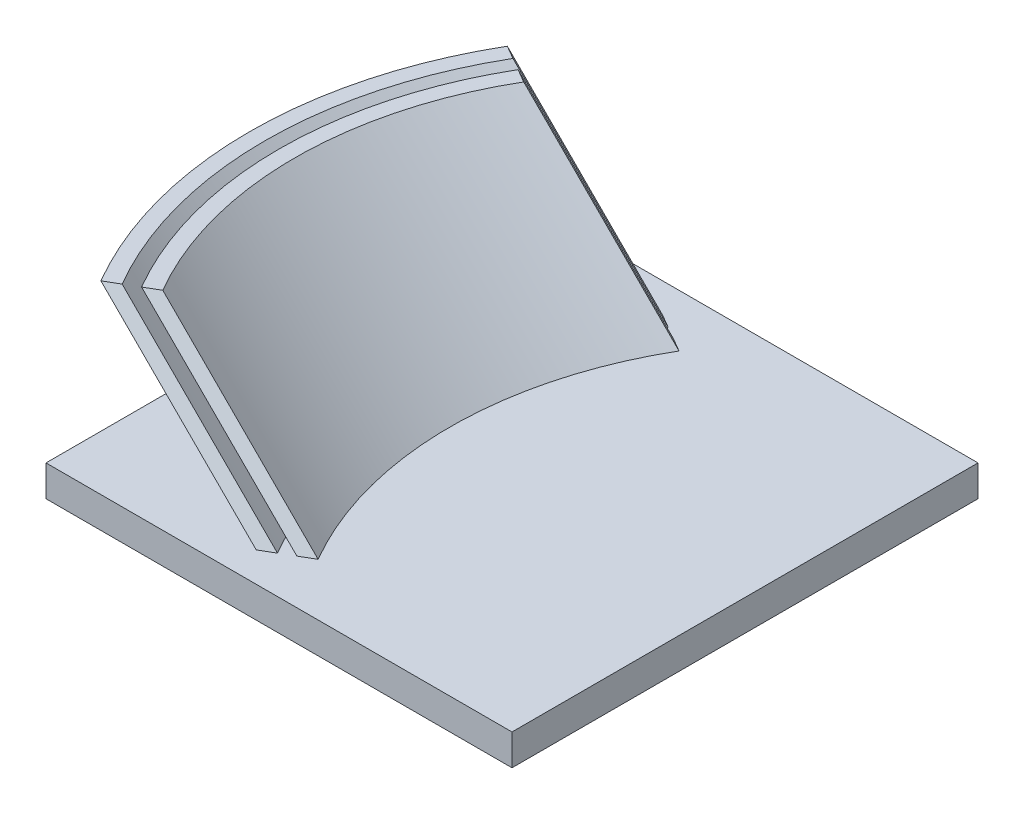
ISO-10303-21;
HEADER;
FILE_DESCRIPTION(('STEP AP214'),'2;1');
FILE_NAME('part.step','',(''),(''),'','','');
FILE_SCHEMA(('AUTOMOTIVE_DESIGN { 1 0 10303 214 1 1 1 1 }'));
ENDSEC;
DATA;
#1=APPLICATION_CONTEXT('core data for automotive mechanical design processes');
#2=APPLICATION_PROTOCOL_DEFINITION('international standard','automotive_design',2000,#1);
#3=PRODUCT_CONTEXT('',#1,'mechanical');
#4=PRODUCT('Part','Part','',(#3));
#5=PRODUCT_RELATED_PRODUCT_CATEGORY('part','',(#4));
#6=PRODUCT_DEFINITION_FORMATION('','',#4);
#7=PRODUCT_DEFINITION_CONTEXT('part definition',#1,'design');
#8=PRODUCT_DEFINITION('design','',#6,#7);
#9=PRODUCT_DEFINITION_SHAPE('','',#8);
#10=(LENGTH_UNIT() NAMED_UNIT(*) SI_UNIT(.MILLI.,.METRE.));
#11=(NAMED_UNIT(*) PLANE_ANGLE_UNIT() SI_UNIT($,.RADIAN.));
#12=(NAMED_UNIT(*) SI_UNIT($,.STERADIAN.) SOLID_ANGLE_UNIT());
#13=UNCERTAINTY_MEASURE_WITH_UNIT(LENGTH_MEASURE(1.E-05),#10,'distance_accuracy_value','');
#14=(GEOMETRIC_REPRESENTATION_CONTEXT(3) GLOBAL_UNCERTAINTY_ASSIGNED_CONTEXT((#13)) GLOBAL_UNIT_ASSIGNED_CONTEXT((#10,
#11,#12)) REPRESENTATION_CONTEXT('',''));
#15=CARTESIAN_POINT('',(0.,0.,0.));
#16=DIRECTION('',(0.,0.,1.));
#17=DIRECTION('',(1.,0.,0.));
#18=AXIS2_PLACEMENT_3D('',#15,#16,#17);
#19=CARTESIAN_POINT('',(-15.,2.,-15.));
#20=DIRECTION('',(1.,0.,0.));
#21=DIRECTION('',(0.,0.,-1.));
#22=AXIS2_PLACEMENT_3D('',#19,#20,#21);
#23=PLANE('',#22);
#24=DIRECTION('',(0.,0.,1.));
#25=VECTOR('',#24,1.);
#26=CARTESIAN_POINT('',(-15.,0.,-15.));
#27=LINE('',#26,#25);
#28=CARTESIAN_POINT('',(-15.,0.,-15.));
#29=VERTEX_POINT('',#28);
#30=CARTESIAN_POINT('',(-15.,0.,15.));
#31=VERTEX_POINT('',#30);
#32=EDGE_CURVE('E187',#29,#31,#27,.T.);
#33=ORIENTED_EDGE('',*,*,#32,.T.);
#34=DIRECTION('',(0.,-1.,0.));
#35=VECTOR('',#34,1.);
#36=CARTESIAN_POINT('',(-15.,2.,15.));
#37=LINE('',#36,#35);
#38=CARTESIAN_POINT('',(-15.,2.,15.));
#39=VERTEX_POINT('',#38);
#40=EDGE_CURVE('E11',#39,#31,#37,.T.);
#41=ORIENTED_EDGE('',*,*,#40,.F.);
#42=DIRECTION('',(0.,0.,1.));
#43=VECTOR('',#42,1.);
#44=CARTESIAN_POINT('',(-15.,2.,-15.));
#45=LINE('',#44,#43);
#46=CARTESIAN_POINT('',(-15.,2.,-15.));
#47=VERTEX_POINT('',#46);
#48=EDGE_CURVE('E188',#47,#39,#45,.T.);
#49=ORIENTED_EDGE('',*,*,#48,.F.);
#50=DIRECTION('',(0.,-1.,0.));
#51=VECTOR('',#50,1.);
#52=CARTESIAN_POINT('',(-15.,2.,-15.));
#53=LINE('',#52,#51);
#54=EDGE_CURVE('E200',#47,#29,#53,.T.);
#55=ORIENTED_EDGE('',*,*,#54,.T.);
#56=EDGE_LOOP('',(#33,#41,#49,#55));
#57=FACE_BOUND('',#56,.T.);
#58=ADVANCED_FACE('F33',(#57),#23,.F.);
#59=CARTESIAN_POINT('',(-15.,2.,15.));
#60=DIRECTION('',(0.,0.,-1.));
#61=DIRECTION('',(-1.,0.,0.));
#62=AXIS2_PLACEMENT_3D('',#59,#60,#61);
#63=PLANE('',#62);
#64=DIRECTION('',(1.,0.,0.));
#65=VECTOR('',#64,1.);
#66=CARTESIAN_POINT('',(-15.,0.,15.));
#67=LINE('',#66,#65);
#68=CARTESIAN_POINT('',(15.,0.,15.));
#69=VERTEX_POINT('',#68);
#70=EDGE_CURVE('E203',#31,#69,#67,.T.);
#71=ORIENTED_EDGE('',*,*,#70,.T.);
#72=DIRECTION('',(0.,-1.,0.));
#73=VECTOR('',#72,1.);
#74=CARTESIAN_POINT('',(15.,2.,15.));
#75=LINE('',#74,#73);
#76=CARTESIAN_POINT('',(15.,2.,15.));
#77=VERTEX_POINT('',#76);
#78=EDGE_CURVE('E40',#77,#69,#75,.T.);
#79=ORIENTED_EDGE('',*,*,#78,.F.);
#80=DIRECTION('',(1.,0.,0.));
#81=VECTOR('',#80,1.);
#82=CARTESIAN_POINT('',(-15.,2.,15.));
#83=LINE('',#82,#81);
#84=EDGE_CURVE('E191',#39,#77,#83,.T.);
#85=ORIENTED_EDGE('',*,*,#84,.F.);
#86=ORIENTED_EDGE('',*,*,#40,.T.);
#87=EDGE_LOOP('',(#71,#79,#85,#86));
#88=FACE_BOUND('',#87,.T.);
#89=ADVANCED_FACE('F219',(#88),#63,.F.);
#90=CARTESIAN_POINT('',(15.,2.,-15.));
#91=DIRECTION('',(1.,0.,0.));
#92=DIRECTION('',(0.,0.,-1.));
#93=AXIS2_PLACEMENT_3D('',#90,#91,#92);
#94=PLANE('',#93);
#95=DIRECTION('',(0.,0.,1.));
#96=VECTOR('',#95,1.);
#97=CARTESIAN_POINT('',(15.,0.,-15.));
#98=LINE('',#97,#96);
#99=CARTESIAN_POINT('',(15.,0.,-15.));
#100=VERTEX_POINT('',#99);
#101=EDGE_CURVE('E206',#100,#69,#98,.T.);
#102=ORIENTED_EDGE('',*,*,#101,.F.);
#103=DIRECTION('',(0.,-1.,0.));
#104=VECTOR('',#103,1.);
#105=CARTESIAN_POINT('',(15.,2.,-15.));
#106=LINE('',#105,#104);
#107=CARTESIAN_POINT('',(15.,2.,-15.));
#108=VERTEX_POINT('',#107);
#109=EDGE_CURVE('E212',#108,#100,#106,.T.);
#110=ORIENTED_EDGE('',*,*,#109,.F.);
#111=DIRECTION('',(0.,0.,1.));
#112=VECTOR('',#111,1.);
#113=CARTESIAN_POINT('',(15.,2.,-15.));
#114=LINE('',#113,#112);
#115=EDGE_CURVE('E194',#108,#77,#114,.T.);
#116=ORIENTED_EDGE('',*,*,#115,.T.);
#117=ORIENTED_EDGE('',*,*,#78,.T.);
#118=EDGE_LOOP('',(#102,#110,#116,#117));
#119=FACE_BOUND('',#118,.T.);
#120=ADVANCED_FACE('F216',(#119),#94,.T.);
#121=CARTESIAN_POINT('',(-15.,2.,-15.));
#122=DIRECTION('',(0.,0.,-1.));
#123=DIRECTION('',(-1.,0.,0.));
#124=AXIS2_PLACEMENT_3D('',#121,#122,#123);
#125=PLANE('',#124);
#126=DIRECTION('',(1.,0.,0.));
#127=VECTOR('',#126,1.);
#128=CARTESIAN_POINT('',(-15.,0.,-15.));
#129=LINE('',#128,#127);
#130=EDGE_CURVE('E192',#29,#100,#129,.T.);
#131=ORIENTED_EDGE('',*,*,#130,.F.);
#132=ORIENTED_EDGE('',*,*,#54,.F.);
#133=DIRECTION('',(1.,0.,0.));
#134=VECTOR('',#133,1.);
#135=CARTESIAN_POINT('',(-15.,2.,-15.));
#136=LINE('',#135,#134);
#137=EDGE_CURVE('E197',#47,#108,#136,.T.);
#138=ORIENTED_EDGE('',*,*,#137,.T.);
#139=ORIENTED_EDGE('',*,*,#109,.T.);
#140=EDGE_LOOP('',(#131,#132,#138,#139));
#141=FACE_BOUND('',#140,.T.);
#142=ADVANCED_FACE('F226',(#141),#125,.T.);
#143=CARTESIAN_POINT('',(0.,2.,0.));
#144=DIRECTION('',(0.,1.,0.));
#145=DIRECTION('',(0.,0.,1.));
#146=AXIS2_PLACEMENT_3D('',#143,#144,#145);
#147=PLANE('',#146);
#148=CARTESIAN_POINT('',(19.0856,2.,0.));
#149=DIRECTION('',(0.,1.,0.));
#150=DIRECTION('',(0.,0.,1.));
#151=AXIS2_PLACEMENT_3D('',#148,#149,#150);
#152=CIRCLE('',#151,26.);
#153=CARTESIAN_POINT('',(-3.38297345298926,2.,-13.0829357174767));
#154=VERTEX_POINT('',#153);
#155=CARTESIAN_POINT('',(-3.38297345298923,2.,13.0829357174767));
#156=VERTEX_POINT('',#155);
#157=EDGE_CURVE('E116',#154,#156,#152,.T.);
#158=ORIENTED_EDGE('',*,*,#157,.F.);
#159=DIRECTION('',(-0.864175902038048,0.,-0.503189835287564));
#160=VECTOR('',#159,1.);
#161=CARTESIAN_POINT('',(-2.51879755095121,2.,-12.5797458821891));
#162=LINE('',#161,#160);
#163=CARTESIAN_POINT('',(-2.51879755095121,2.,-12.5797458821891));
#164=VERTEX_POINT('',#163);
#165=EDGE_CURVE('E120',#164,#154,#162,.T.);
#166=ORIENTED_EDGE('',*,*,#165,.F.);
#167=CARTESIAN_POINT('',(19.0856,2.,0.));
#168=DIRECTION('',(0.,-1.,0.));
#169=DIRECTION('',(0.,0.,-1.));
#170=AXIS2_PLACEMENT_3D('',#167,#168,#169);
#171=CIRCLE('',#170,25.);
#172=CARTESIAN_POINT('',(-2.51879755095118,2.,12.5797458821891));
#173=VERTEX_POINT('',#172);
#174=EDGE_CURVE('E52',#173,#164,#171,.T.);
#175=ORIENTED_EDGE('',*,*,#174,.F.);
#176=DIRECTION('',(0.864175902038047,0.,-0.503189835287566));
#177=VECTOR('',#176,1.);
#178=CARTESIAN_POINT('',(-2.51879755095119,2.,12.5797458821891));
#179=LINE('',#178,#177);
#180=EDGE_CURVE('E47',#156,#173,#179,.T.);
#181=ORIENTED_EDGE('',*,*,#180,.F.);
#182=EDGE_LOOP('',(#158,#166,#175,#181));
#183=FACE_BOUND('',#182,.T.);
#184=CARTESIAN_POINT('',(19.0856,2.,0.));
#185=DIRECTION('',(0.,1.,0.));
#186=DIRECTION('',(0.,0.,-1.));
#187=AXIS2_PLACEMENT_3D('',#184,#185,#186);
#188=CIRCLE('',#187,24.0856);
#189=CARTESIAN_POINT('',(-1.72859510612762,2.,-12.1196290968022));
#190=VERTEX_POINT('',#189);
#191=CARTESIAN_POINT('',(-1.72859510612761,2.,12.1196290968022));
#192=VERTEX_POINT('',#191);
#193=EDGE_CURVE('E155',#190,#192,#188,.T.);
#194=ORIENTED_EDGE('',*,*,#193,.F.);
#195=DIRECTION('',(-0.864175902038049,0.,-0.503189835287562));
#196=VECTOR('',#195,1.);
#197=CARTESIAN_POINT('',(-0.864419204089574,2.,-11.6164392615146));
#198=LINE('',#197,#196);
#199=CARTESIAN_POINT('',(-0.864419204089573,2.,-11.6164392615146));
#200=VERTEX_POINT('',#199);
#201=EDGE_CURVE('E168',#200,#190,#198,.T.);
#202=ORIENTED_EDGE('',*,*,#201,.F.);
#203=CARTESIAN_POINT('',(19.0856,2.,0.));
#204=DIRECTION('',(0.,-1.,0.));
#205=DIRECTION('',(0.,0.,1.));
#206=AXIS2_PLACEMENT_3D('',#203,#204,#205);
#207=CIRCLE('',#206,23.0856);
#208=CARTESIAN_POINT('',(-0.864419204089549,2.,11.6164392615146));
#209=VERTEX_POINT('',#208);
#210=EDGE_CURVE('E171',#209,#200,#207,.T.);
#211=ORIENTED_EDGE('',*,*,#210,.F.);
#212=DIRECTION('',(0.864175902038046,0.,-0.503189835287567));
#213=VECTOR('',#212,1.);
#214=CARTESIAN_POINT('',(-0.864419204089549,2.,11.6164392615146));
#215=LINE('',#214,#213);
#216=EDGE_CURVE('E158',#192,#209,#215,.T.);
#217=ORIENTED_EDGE('',*,*,#216,.F.);
#218=EDGE_LOOP('',(#194,#202,#211,#217));
#219=FACE_BOUND('',#218,.T.);
#220=ORIENTED_EDGE('',*,*,#48,.T.);
#221=ORIENTED_EDGE('',*,*,#84,.T.);
#222=ORIENTED_EDGE('',*,*,#115,.F.);
#223=ORIENTED_EDGE('',*,*,#137,.F.);
#224=EDGE_LOOP('',(#220,#221,#222,#223));
#225=FACE_BOUND('',#224,.T.);
#226=ADVANCED_FACE('F118',(#183,#219,#225),#147,.T.);
#227=CARTESIAN_POINT('',(0.,0.,0.));
#228=DIRECTION('',(0.,1.,0.));
#229=DIRECTION('',(0.,0.,1.));
#230=AXIS2_PLACEMENT_3D('',#227,#228,#229);
#231=PLANE('',#230);
#232=ORIENTED_EDGE('',*,*,#32,.F.);
#233=ORIENTED_EDGE('',*,*,#130,.T.);
#234=ORIENTED_EDGE('',*,*,#101,.T.);
#235=ORIENTED_EDGE('',*,*,#70,.F.);
#236=EDGE_LOOP('',(#232,#233,#234,#235));
#237=FACE_BOUND('',#236,.T.);
#238=ADVANCED_FACE('F223',(#237),#231,.F.);
#239=CARTESIAN_POINT('',(9.0856,11.9999999999999,0.));
#240=DIRECTION('',(0.,1.,0.));
#241=DIRECTION('',(0.,0.,1.));
#242=AXIS2_PLACEMENT_3D('',#239,#240,#241);
#243=PLANE('',#242);
#244=CARTESIAN_POINT('',(9.0856,11.9999999999999,0.));
#245=DIRECTION('',(0.,-1.,0.));
#246=DIRECTION('',(0.,0.,1.));
#247=AXIS2_PLACEMENT_3D('',#244,#245,#246);
#248=CIRCLE('',#247,23.0856);
#249=CARTESIAN_POINT('',(-10.8644192040895,11.9999999999999,11.6164392615146));
#250=VERTEX_POINT('',#249);
#251=CARTESIAN_POINT('',(-10.8644192040896,11.9999999999999,-11.6164392615146));
#252=VERTEX_POINT('',#251);
#253=EDGE_CURVE('E176',#250,#252,#248,.T.);
#254=ORIENTED_EDGE('',*,*,#253,.T.);
#255=DIRECTION('',(-0.864175902038049,0.,-0.503189835287562));
#256=VECTOR('',#255,1.);
#257=CARTESIAN_POINT('',(-10.8644192040896,11.9999999999999,-11.6164392615146));
#258=LINE('',#257,#256);
#259=CARTESIAN_POINT('',(-11.7285951061276,11.9999999999999,-12.1196290968022));
#260=VERTEX_POINT('',#259);
#261=EDGE_CURVE('E183',#252,#260,#258,.T.);
#262=ORIENTED_EDGE('',*,*,#261,.T.);
#263=CARTESIAN_POINT('',(9.0856,11.9999999999999,0.));
#264=DIRECTION('',(0.,1.,0.));
#265=DIRECTION('',(0.,0.,-1.));
#266=AXIS2_PLACEMENT_3D('',#263,#264,#265);
#267=CIRCLE('',#266,24.0856);
#268=CARTESIAN_POINT('',(-11.7285951061276,11.9999999999999,12.1196290968022));
#269=VERTEX_POINT('',#268);
#270=EDGE_CURVE('E159',#260,#269,#267,.T.);
#271=ORIENTED_EDGE('',*,*,#270,.T.);
#272=DIRECTION('',(0.864175902038046,0.,-0.503189835287567));
#273=VECTOR('',#272,1.);
#274=CARTESIAN_POINT('',(-10.8644192040895,11.9999999999999,11.6164392615146));
#275=LINE('',#274,#273);
#276=EDGE_CURVE('E165',#269,#250,#275,.T.);
#277=ORIENTED_EDGE('',*,*,#276,.T.);
#278=EDGE_LOOP('',(#254,#262,#271,#277));
#279=FACE_BOUND('',#278,.T.);
#280=ADVANCED_FACE('F244',(#279),#243,.T.);
#281=CARTESIAN_POINT('',(-1.72859510612763,2.,-12.1196290968022));
#282=CARTESIAN_POINT('',(-11.7285951061276,11.9999999999999,-12.1196290968022));
#283=CARTESIAN_POINT('',(-6.19904071351247,2.,-4.442106431691));
#284=CARTESIAN_POINT('',(-16.1990407135125,11.9999999999999,-4.442106431691));
#285=CARTESIAN_POINT('',(-6.19904071351246,2.,4.44210643169102));
#286=CARTESIAN_POINT('',(-16.1990407135125,11.9999999999999,4.44210643169102));
#287=CARTESIAN_POINT('',(-1.7285951061276,2.,12.1196290968022));
#288=CARTESIAN_POINT('',(-11.7285951061276,11.9999999999999,12.1196290968022));
#289=(BOUNDED_SURFACE() B_SPLINE_SURFACE(3,1,((#281,#282),(#283,#284),(#285,#286),(#287,#288)),
.UNSPECIFIED.,.F.,.F.,.F.) B_SPLINE_SURFACE_WITH_KNOTS((4,4),(2,2),(0.,1.),(0.,1.),
.UNSPECIFIED.) GEOMETRIC_REPRESENTATION_ITEM() RATIONAL_B_SPLINE_SURFACE(((1.,1.),
(0.909450601358698,0.909450601358698),(0.909450601358698,0.909450601358698),(1.,1.))) REPRESENTATION_ITEM('') SURFACE());
#290=DIRECTION('',(-0.707106781186551,0.707106781186544,0.));
#291=VECTOR('',#290,1.);
#292=CARTESIAN_POINT('',(-1.7285951061276,2.,12.1196290968022));
#293=LINE('',#292,#291);
#294=EDGE_CURVE('E161',#192,#269,#293,.T.);
#295=DIRECTION('',(-0.707106781186551,0.707106781186544,0.));
#296=VECTOR('',#295,1.);
#297=CARTESIAN_POINT('',(-1.72859510612762,2.,-12.1196290968022));
#298=LINE('',#297,#296);
#299=EDGE_CURVE('E162',#190,#260,#298,.T.);
#300=ORIENTED_EDGE('',*,*,#294,.T.);
#301=ORIENTED_EDGE('',*,*,#270,.F.);
#302=ORIENTED_EDGE('',*,*,#299,.F.);
#303=ORIENTED_EDGE('',*,*,#193,.T.);
#304=EDGE_LOOP('',(#300,#301,#302,#303));
#305=FACE_BOUND('',#304,.T.);
#306=ADVANCED_FACE('F250',(#305),#289,.T.);
#307=CARTESIAN_POINT('',(-0.864419204089549,2.,11.6164392615146));
#308=DIRECTION('',(0.44949168745291,0.449491687452915,0.771954950642501));
#309=DIRECTION('',(0.,-0.864175902038044,0.503189835287572));
#310=AXIS2_PLACEMENT_3D('',#307,#308,#309);
#311=PLANE('',#310);
#312=DIRECTION('',(-0.707106781186551,0.707106781186544,0.));
#313=VECTOR('',#312,1.);
#314=CARTESIAN_POINT('',(-0.864419204089549,2.,11.6164392615146));
#315=LINE('',#314,#313);
#316=EDGE_CURVE('E173',#209,#250,#315,.T.);
#317=ORIENTED_EDGE('',*,*,#316,.T.);
#318=ORIENTED_EDGE('',*,*,#276,.F.);
#319=ORIENTED_EDGE('',*,*,#294,.F.);
#320=ORIENTED_EDGE('',*,*,#216,.T.);
#321=EDGE_LOOP('',(#317,#318,#319,#320));
#322=FACE_BOUND('',#321,.T.);
#323=ADVANCED_FACE('F261',(#322),#311,.T.);
#324=CARTESIAN_POINT('',(-0.864419204089549,2.,11.6164392615146));
#325=CARTESIAN_POINT('',(-10.8644192040895,11.9999999999999,11.6164392615146));
#326=CARTESIAN_POINT('',(-5.14925824126711,2.,4.25767646392225));
#327=CARTESIAN_POINT('',(-15.1492582412671,11.9999999999999,4.25767646392225));
#328=CARTESIAN_POINT('',(-5.14925824126712,2.,-4.25767646392225));
#329=CARTESIAN_POINT('',(-15.1492582412671,11.9999999999999,-4.25767646392225));
#330=CARTESIAN_POINT('',(-0.864419204089566,2.,-11.6164392615146));
#331=CARTESIAN_POINT('',(-10.8644192040896,11.9999999999999,-11.6164392615146));
#332=(BOUNDED_SURFACE() B_SPLINE_SURFACE(3,1,((#324,#325),(#326,#327),(#328,#329),(#330,#331)),
.UNSPECIFIED.,.F.,.F.,.F.) B_SPLINE_SURFACE_WITH_KNOTS((4,4),(2,2),(0.,1.),(0.,1.),
.UNSPECIFIED.) GEOMETRIC_REPRESENTATION_ITEM() RATIONAL_B_SPLINE_SURFACE(((1.,1.),
(0.909450601358698,0.909450601358698),(0.909450601358698,0.909450601358698),(1.,1.))) REPRESENTATION_ITEM('') SURFACE());
#333=DIRECTION('',(-0.707106781186551,0.707106781186544,0.));
#334=VECTOR('',#333,1.);
#335=CARTESIAN_POINT('',(-0.864419204089574,2.,-11.6164392615146));
#336=LINE('',#335,#334);
#337=EDGE_CURVE('E180',#200,#252,#336,.T.);
#338=ORIENTED_EDGE('',*,*,#337,.T.);
#339=ORIENTED_EDGE('',*,*,#253,.F.);
#340=ORIENTED_EDGE('',*,*,#316,.F.);
#341=ORIENTED_EDGE('',*,*,#210,.T.);
#342=EDGE_LOOP('',(#338,#339,#340,#341));
#343=FACE_BOUND('',#342,.T.);
#344=ADVANCED_FACE('F255',(#343),#332,.T.);
#345=CARTESIAN_POINT('',(-0.864419204089574,2.,-11.6164392615146));
#346=DIRECTION('',(0.449491687452906,0.449491687452911,-0.771954950642506));
#347=DIRECTION('',(0.,0.864175902038047,0.503189835287566));
#348=AXIS2_PLACEMENT_3D('',#345,#346,#347);
#349=PLANE('',#348);
#350=ORIENTED_EDGE('',*,*,#261,.F.);
#351=ORIENTED_EDGE('',*,*,#337,.F.);
#352=ORIENTED_EDGE('',*,*,#201,.T.);
#353=ORIENTED_EDGE('',*,*,#299,.T.);
#354=EDGE_LOOP('',(#350,#351,#352,#353));
#355=FACE_BOUND('',#354,.T.);
#356=ADVANCED_FACE('F245',(#355),#349,.T.);
#357=CARTESIAN_POINT('',(9.0856,11.9999999999999,0.));
#358=DIRECTION('',(0.,1.,0.));
#359=DIRECTION('',(0.,0.,1.));
#360=AXIS2_PLACEMENT_3D('',#357,#358,#359);
#361=PLANE('',#360);
#362=CARTESIAN_POINT('',(9.0856,11.9999999999999,0.));
#363=DIRECTION('',(0.,1.,0.));
#364=DIRECTION('',(0.,0.,1.));
#365=AXIS2_PLACEMENT_3D('',#362,#363,#364);
#366=CIRCLE('',#365,26.);
#367=CARTESIAN_POINT('',(-13.3829734529893,11.9999999999999,-13.0829357174767));
#368=VERTEX_POINT('',#367);
#369=CARTESIAN_POINT('',(-13.3829734529892,11.9999999999999,13.0829357174767));
#370=VERTEX_POINT('',#369);
#371=EDGE_CURVE('E137',#368,#370,#366,.T.);
#372=ORIENTED_EDGE('',*,*,#371,.T.);
#373=DIRECTION('',(0.864175902038047,0.,-0.503189835287566));
#374=VECTOR('',#373,1.);
#375=CARTESIAN_POINT('',(-12.5187975509512,11.9999999999999,12.5797458821891));
#376=LINE('',#375,#374);
#377=CARTESIAN_POINT('',(-12.5187975509512,11.9999999999999,12.5797458821891));
#378=VERTEX_POINT('',#377);
#379=EDGE_CURVE('E144',#370,#378,#376,.T.);
#380=ORIENTED_EDGE('',*,*,#379,.T.);
#381=CARTESIAN_POINT('',(9.0856,11.9999999999999,0.));
#382=DIRECTION('',(0.,-1.,0.));
#383=DIRECTION('',(0.,0.,-1.));
#384=AXIS2_PLACEMENT_3D('',#381,#382,#383);
#385=CIRCLE('',#384,25.);
#386=CARTESIAN_POINT('',(-12.5187975509512,11.9999999999999,-12.5797458821891));
#387=VERTEX_POINT('',#386);
#388=EDGE_CURVE('E149',#378,#387,#385,.T.);
#389=ORIENTED_EDGE('',*,*,#388,.T.);
#390=DIRECTION('',(-0.864175902038048,0.,-0.503189835287564));
#391=VECTOR('',#390,1.);
#392=CARTESIAN_POINT('',(-12.5187975509512,11.9999999999999,-12.5797458821891));
#393=LINE('',#392,#391);
#394=EDGE_CURVE('E152',#387,#368,#393,.T.);
#395=ORIENTED_EDGE('',*,*,#394,.T.);
#396=EDGE_LOOP('',(#372,#380,#389,#395));
#397=FACE_BOUND('',#396,.T.);
#398=ADVANCED_FACE('F254',(#397),#361,.T.);
#399=CARTESIAN_POINT('',(-3.38297345298925,2.,-13.0829357174767));
#400=CARTESIAN_POINT('',(-13.3829734529893,11.9999999999999,-13.0829357174767));
#401=CARTESIAN_POINT('',(-8.20874427837895,2.,-4.7951791619875));
#402=CARTESIAN_POINT('',(-18.208744278379,11.9999999999999,-4.7951791619875));
#403=CARTESIAN_POINT('',(-8.20874427837895,2.,4.79517916198749));
#404=CARTESIAN_POINT('',(-18.2087442783789,11.9999999999999,4.79517916198749));
#405=CARTESIAN_POINT('',(-3.38297345298924,2.,13.0829357174767));
#406=CARTESIAN_POINT('',(-13.3829734529892,11.9999999999999,13.0829357174767));
#407=(BOUNDED_SURFACE() B_SPLINE_SURFACE(3,1,((#399,#400),(#401,#402),(#403,#404),(#405,#406)),
.UNSPECIFIED.,.F.,.F.,.F.) B_SPLINE_SURFACE_WITH_KNOTS((4,4),(2,2),(0.,1.),(0.,1.),
.UNSPECIFIED.) GEOMETRIC_REPRESENTATION_ITEM() RATIONAL_B_SPLINE_SURFACE(((1.,1.),
(0.909450601358698,0.909450601358698),(0.909450601358698,0.909450601358698),(1.,1.))) REPRESENTATION_ITEM('') SURFACE());
#408=DIRECTION('',(-0.707106781186551,0.707106781186544,0.));
#409=VECTOR('',#408,1.);
#410=CARTESIAN_POINT('',(-3.38297345298923,2.,13.0829357174767));
#411=LINE('',#410,#409);
#412=EDGE_CURVE('E139',#156,#370,#411,.T.);
#413=DIRECTION('',(-0.707106781186551,0.707106781186544,0.));
#414=VECTOR('',#413,1.);
#415=CARTESIAN_POINT('',(-3.38297345298926,2.,-13.0829357174767));
#416=LINE('',#415,#414);
#417=EDGE_CURVE('E131',#154,#368,#416,.T.);
#418=ORIENTED_EDGE('',*,*,#412,.T.);
#419=ORIENTED_EDGE('',*,*,#371,.F.);
#420=ORIENTED_EDGE('',*,*,#417,.F.);
#421=ORIENTED_EDGE('',*,*,#157,.T.);
#422=EDGE_LOOP('',(#418,#419,#420,#421));
#423=FACE_BOUND('',#422,.T.);
#424=ADVANCED_FACE('F136',(#423),#407,.T.);
#425=CARTESIAN_POINT('',(-2.51879755095119,2.,12.5797458821891));
#426=DIRECTION('',(0.449491687452909,0.449491687452914,0.771954950642502));
#427=DIRECTION('',(0.,-0.864175902038045,0.50318983528757));
#428=AXIS2_PLACEMENT_3D('',#425,#426,#427);
#429=PLANE('',#428);
#430=DIRECTION('',(-0.707106781186551,0.707106781186544,0.));
#431=VECTOR('',#430,1.);
#432=CARTESIAN_POINT('',(-2.51879755095118,2.,12.5797458821891));
#433=LINE('',#432,#431);
#434=EDGE_CURVE('E146',#173,#378,#433,.T.);
#435=ORIENTED_EDGE('',*,*,#434,.T.);
#436=ORIENTED_EDGE('',*,*,#379,.F.);
#437=ORIENTED_EDGE('',*,*,#412,.F.);
#438=ORIENTED_EDGE('',*,*,#180,.T.);
#439=EDGE_LOOP('',(#435,#436,#437,#438));
#440=FACE_BOUND('',#439,.T.);
#441=ADVANCED_FACE('F291',(#440),#429,.T.);
#442=CARTESIAN_POINT('',(-2.51879755095118,2.,12.5797458821891));
#443=CARTESIAN_POINT('',(-12.5187975509512,11.9999999999999,12.5797458821891));
#444=CARTESIAN_POINT('',(-7.1589618061336,2.,4.61074919421876));
#445=CARTESIAN_POINT('',(-17.1589618061336,11.9999999999999,4.61074919421876));
#446=CARTESIAN_POINT('',(-7.15896180613361,2.,-4.61074919421874));
#447=CARTESIAN_POINT('',(-17.1589618061336,11.9999999999999,-4.61074919421874));
#448=CARTESIAN_POINT('',(-2.51879755095121,2.,-12.5797458821891));
#449=CARTESIAN_POINT('',(-12.5187975509512,11.9999999999999,-12.5797458821891));
#450=(BOUNDED_SURFACE() B_SPLINE_SURFACE(3,1,((#442,#443),(#444,#445),(#446,#447),(#448,#449)),
.UNSPECIFIED.,.F.,.F.,.F.) B_SPLINE_SURFACE_WITH_KNOTS((4,4),(2,2),(0.,1.),(0.,1.),
.UNSPECIFIED.) GEOMETRIC_REPRESENTATION_ITEM() RATIONAL_B_SPLINE_SURFACE(((1.,1.),
(0.909450601358698,0.909450601358698),(0.909450601358698,0.909450601358698),(1.,1.))) REPRESENTATION_ITEM('') SURFACE());
#451=DIRECTION('',(-0.707106781186551,0.707106781186544,0.));
#452=VECTOR('',#451,1.);
#453=CARTESIAN_POINT('',(-2.51879755095121,2.,-12.5797458821891));
#454=LINE('',#453,#452);
#455=EDGE_CURVE('E133',#164,#387,#454,.T.);
#456=ORIENTED_EDGE('',*,*,#455,.T.);
#457=ORIENTED_EDGE('',*,*,#388,.F.);
#458=ORIENTED_EDGE('',*,*,#434,.F.);
#459=ORIENTED_EDGE('',*,*,#174,.T.);
#460=EDGE_LOOP('',(#456,#457,#458,#459));
#461=FACE_BOUND('',#460,.T.);
#462=ADVANCED_FACE('F286',(#461),#450,.T.);
#463=CARTESIAN_POINT('',(-2.51879755095121,2.,-12.5797458821891));
#464=DIRECTION('',(0.449491687452908,0.449491687452913,-0.771954950642504));
#465=DIRECTION('',(0.,0.864175902038046,0.503189835287568));
#466=AXIS2_PLACEMENT_3D('',#463,#464,#465);
#467=PLANE('',#466);
#468=ORIENTED_EDGE('',*,*,#394,.F.);
#469=ORIENTED_EDGE('',*,*,#455,.F.);
#470=ORIENTED_EDGE('',*,*,#165,.T.);
#471=ORIENTED_EDGE('',*,*,#417,.T.);
#472=EDGE_LOOP('',(#468,#469,#470,#471));
#473=FACE_BOUND('',#472,.T.);
#474=ADVANCED_FACE('F130',(#473),#467,.T.);
#475=CLOSED_SHELL('',(#58,#89,#120,#142,#226,#238,#280,#306,#323,#344,#356,#398,#424,#441,#462,#474));
#476=MANIFOLD_SOLID_BREP('B2',#475);
#477=ADVANCED_BREP_SHAPE_REPRESENTATION('',(#18,#476),#14);
#478=SHAPE_DEFINITION_REPRESENTATION(#9,#477);
ENDSEC;
END-ISO-10303-21;
